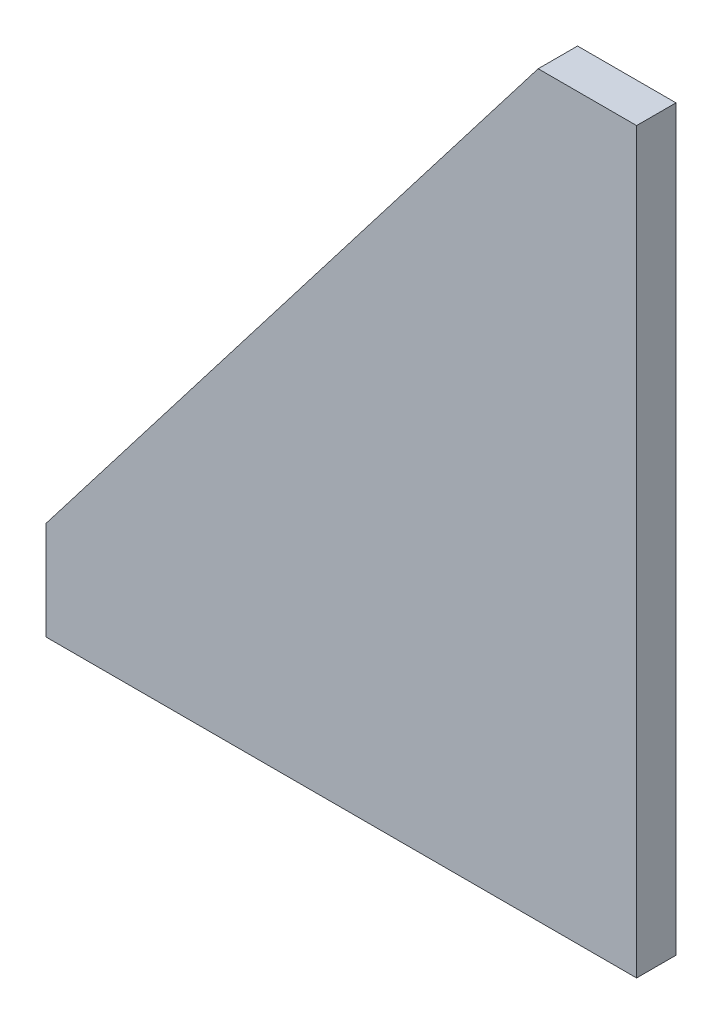
ISO-10303-21;
HEADER;
FILE_DESCRIPTION(('STEP AP214'),'2;1');
FILE_NAME('part.step','',(''),(''),'','','');
FILE_SCHEMA(('AUTOMOTIVE_DESIGN { 1 0 10303 214 1 1 1 1 }'));
ENDSEC;
DATA;
#1=APPLICATION_CONTEXT('core data for automotive mechanical design processes');
#2=APPLICATION_PROTOCOL_DEFINITION('international standard','automotive_design',2000,#1);
#3=PRODUCT_CONTEXT('',#1,'mechanical');
#4=PRODUCT('Part','Part','',(#3));
#5=PRODUCT_RELATED_PRODUCT_CATEGORY('part','',(#4));
#6=PRODUCT_DEFINITION_FORMATION('','',#4);
#7=PRODUCT_DEFINITION_CONTEXT('part definition',#1,'design');
#8=PRODUCT_DEFINITION('design','',#6,#7);
#9=PRODUCT_DEFINITION_SHAPE('','',#8);
#10=(LENGTH_UNIT() NAMED_UNIT(*) SI_UNIT(.MILLI.,.METRE.));
#11=(NAMED_UNIT(*) PLANE_ANGLE_UNIT() SI_UNIT($,.RADIAN.));
#12=(NAMED_UNIT(*) SI_UNIT($,.STERADIAN.) SOLID_ANGLE_UNIT());
#13=UNCERTAINTY_MEASURE_WITH_UNIT(LENGTH_MEASURE(1.E-05),#10,'distance_accuracy_value','');
#14=(GEOMETRIC_REPRESENTATION_CONTEXT(3) GLOBAL_UNCERTAINTY_ASSIGNED_CONTEXT((#13)) GLOBAL_UNIT_ASSIGNED_CONTEXT((#10,
#11,#12)) REPRESENTATION_CONTEXT('',''));
#15=CARTESIAN_POINT('',(0.,0.,0.));
#16=DIRECTION('',(0.,0.,1.));
#17=DIRECTION('',(1.,0.,0.));
#18=AXIS2_PLACEMENT_3D('',#15,#16,#17);
#19=CARTESIAN_POINT('',(0.,0.,-8.00000000000001));
#20=DIRECTION('',(0.,-1.,0.));
#21=DIRECTION('',(0.,0.,-1.00000000000001));
#22=AXIS2_PLACEMENT_3D('',#19,#20,#21);
#23=PLANE('',#22);
#24=DIRECTION('',(1.,0.,0.));
#25=VECTOR('',#24,1.);
#26=CARTESIAN_POINT('',(0.,0.,0.));
#27=LINE('',#26,#25);
#28=CARTESIAN_POINT('',(0.,0.,0.));
#29=VERTEX_POINT('',#28);
#30=CARTESIAN_POINT('',(119.999999999998,3.99680288865056E-12,0.));
#31=VERTEX_POINT('',#30);
#32=EDGE_CURVE('E113',#29,#31,#27,.T.);
#33=ORIENTED_EDGE('',*,*,#32,.F.);
#34=DIRECTION('',(0.,0.,1.00000000000001));
#35=VECTOR('',#34,1.);
#36=CARTESIAN_POINT('',(0.,0.,-8.00000000000001));
#37=LINE('',#36,#35);
#38=CARTESIAN_POINT('',(0.,0.,-8.00000000000001));
#39=VERTEX_POINT('',#38);
#40=EDGE_CURVE('E11',#39,#29,#37,.T.);
#41=ORIENTED_EDGE('',*,*,#40,.F.);
#42=DIRECTION('',(1.,0.,0.));
#43=VECTOR('',#42,1.);
#44=CARTESIAN_POINT('',(0.,0.,-8.00000000000001));
#45=LINE('',#44,#43);
#46=CARTESIAN_POINT('',(119.999999999998,3.99680288865056E-12,-8.00000000000001));
#47=VERTEX_POINT('',#46);
#48=EDGE_CURVE('E108',#39,#47,#45,.T.);
#49=ORIENTED_EDGE('',*,*,#48,.T.);
#50=DIRECTION('',(0.,0.,1.00000000000001));
#51=VECTOR('',#50,1.);
#52=CARTESIAN_POINT('',(119.999999999998,3.99680288865056E-12,-8.00000000000001));
#53=LINE('',#52,#51);
#54=EDGE_CURVE('E39',#47,#31,#53,.T.);
#55=ORIENTED_EDGE('',*,*,#54,.T.);
#56=EDGE_LOOP('',(#33,#41,#49,#55));
#57=FACE_BOUND('',#56,.T.);
#58=ADVANCED_FACE('F36',(#57),#23,.T.);
#59=CARTESIAN_POINT('',(0.,20.,-8.00000000000001));
#60=DIRECTION('',(-1.,0.,0.));
#61=DIRECTION('',(0.,-1.,0.));
#62=AXIS2_PLACEMENT_3D('',#59,#60,#61);
#63=PLANE('',#62);
#64=DIRECTION('',(0.,-1.,0.));
#65=VECTOR('',#64,1.);
#66=CARTESIAN_POINT('',(0.,20.,0.));
#67=LINE('',#66,#65);
#68=CARTESIAN_POINT('',(0.,20.,0.));
#69=VERTEX_POINT('',#68);
#70=EDGE_CURVE('E122',#69,#29,#67,.T.);
#71=ORIENTED_EDGE('',*,*,#70,.F.);
#72=DIRECTION('',(0.,0.,1.00000000000001));
#73=VECTOR('',#72,1.);
#74=CARTESIAN_POINT('',(0.,20.,-8.00000000000001));
#75=LINE('',#74,#73);
#76=CARTESIAN_POINT('',(0.,20.,-8.00000000000001));
#77=VERTEX_POINT('',#76);
#78=EDGE_CURVE('E45',#77,#69,#75,.T.);
#79=ORIENTED_EDGE('',*,*,#78,.F.);
#80=DIRECTION('',(0.,-1.,0.));
#81=VECTOR('',#80,1.);
#82=CARTESIAN_POINT('',(0.,20.,-8.00000000000001));
#83=LINE('',#82,#81);
#84=EDGE_CURVE('E103',#77,#39,#83,.T.);
#85=ORIENTED_EDGE('',*,*,#84,.T.);
#86=ORIENTED_EDGE('',*,*,#40,.T.);
#87=EDGE_LOOP('',(#71,#79,#85,#86));
#88=FACE_BOUND('',#87,.T.);
#89=ADVANCED_FACE('F128',(#88),#63,.T.);
#90=CARTESIAN_POINT('',(100.,150.,-8.00000000000001));
#91=DIRECTION('',(-0.792623989104602,0.609710760849694,0.));
#92=DIRECTION('',(-0.609710760849691,-0.792623989104598,0.));
#93=AXIS2_PLACEMENT_3D('',#90,#91,#92);
#94=PLANE('',#93);
#95=DIRECTION('',(-0.60971076084969,-0.792623989104598,0.));
#96=VECTOR('',#95,1.);
#97=CARTESIAN_POINT('',(100.,150.,0.));
#98=LINE('',#97,#96);
#99=CARTESIAN_POINT('',(100.,150.,0.));
#100=VERTEX_POINT('',#99);
#101=EDGE_CURVE('E92',#100,#69,#98,.T.);
#102=ORIENTED_EDGE('',*,*,#101,.F.);
#103=DIRECTION('',(0.,0.,1.00000000000001));
#104=VECTOR('',#103,1.);
#105=CARTESIAN_POINT('',(100.,150.,-8.00000000000001));
#106=LINE('',#105,#104);
#107=CARTESIAN_POINT('',(100.,150.,-8.00000000000001));
#108=VERTEX_POINT('',#107);
#109=EDGE_CURVE('E87',#108,#100,#106,.T.);
#110=ORIENTED_EDGE('',*,*,#109,.F.);
#111=DIRECTION('',(-0.60971076084969,-0.792623989104598,0.));
#112=VECTOR('',#111,1.);
#113=CARTESIAN_POINT('',(100.,150.,-8.00000000000001));
#114=LINE('',#113,#112);
#115=EDGE_CURVE('E90',#108,#77,#114,.T.);
#116=ORIENTED_EDGE('',*,*,#115,.T.);
#117=ORIENTED_EDGE('',*,*,#78,.T.);
#118=EDGE_LOOP('',(#102,#110,#116,#117));
#119=FACE_BOUND('',#118,.T.);
#120=ADVANCED_FACE('F89',(#119),#94,.T.);
#121=CARTESIAN_POINT('',(120.,150.000000000004,-8.00000000000001));
#122=DIRECTION('',(0.,1.,0.));
#123=DIRECTION('',(0.,0.,1.00000000000001));
#124=AXIS2_PLACEMENT_3D('',#121,#122,#123);
#125=PLANE('',#124);
#126=DIRECTION('',(-1.,0.,0.));
#127=VECTOR('',#126,1.);
#128=CARTESIAN_POINT('',(120.,150.000000000004,0.));
#129=LINE('',#128,#127);
#130=CARTESIAN_POINT('',(120.,150.000000000004,0.));
#131=VERTEX_POINT('',#130);
#132=EDGE_CURVE('E119',#131,#100,#129,.T.);
#133=ORIENTED_EDGE('',*,*,#132,.F.);
#134=DIRECTION('',(0.,0.,1.00000000000001));
#135=VECTOR('',#134,1.);
#136=CARTESIAN_POINT('',(120.,150.000000000004,-8.00000000000001));
#137=LINE('',#136,#135);
#138=CARTESIAN_POINT('',(120.,150.000000000004,-8.00000000000001));
#139=VERTEX_POINT('',#138);
#140=EDGE_CURVE('E97',#139,#131,#137,.T.);
#141=ORIENTED_EDGE('',*,*,#140,.F.);
#142=DIRECTION('',(-1.,0.,0.));
#143=VECTOR('',#142,1.);
#144=CARTESIAN_POINT('',(120.,150.000000000004,-8.00000000000001));
#145=LINE('',#144,#143);
#146=EDGE_CURVE('E102',#139,#108,#145,.T.);
#147=ORIENTED_EDGE('',*,*,#146,.T.);
#148=ORIENTED_EDGE('',*,*,#109,.T.);
#149=EDGE_LOOP('',(#133,#141,#147,#148));
#150=FACE_BOUND('',#149,.T.);
#151=ADVANCED_FACE('F105',(#150),#125,.T.);
#152=CARTESIAN_POINT('',(119.999999999998,3.99680288865056E-12,-8.00000000000001));
#153=DIRECTION('',(1.,0.,0.));
#154=DIRECTION('',(0.,0.,-1.00000000000001));
#155=AXIS2_PLACEMENT_3D('',#152,#153,#154);
#156=PLANE('',#155);
#157=DIRECTION('',(0.,1.,0.));
#158=VECTOR('',#157,1.);
#159=CARTESIAN_POINT('',(119.999999999998,3.99680288865056E-12,0.));
#160=LINE('',#159,#158);
#161=EDGE_CURVE('E116',#31,#131,#160,.T.);
#162=ORIENTED_EDGE('',*,*,#161,.F.);
#163=ORIENTED_EDGE('',*,*,#54,.F.);
#164=DIRECTION('',(0.,1.,0.));
#165=VECTOR('',#164,1.);
#166=CARTESIAN_POINT('',(119.999999999998,3.99680288865056E-12,-8.00000000000001));
#167=LINE('',#166,#165);
#168=EDGE_CURVE('E106',#47,#139,#167,.T.);
#169=ORIENTED_EDGE('',*,*,#168,.T.);
#170=ORIENTED_EDGE('',*,*,#140,.T.);
#171=EDGE_LOOP('',(#162,#163,#169,#170));
#172=FACE_BOUND('',#171,.T.);
#173=ADVANCED_FACE('F125',(#172),#156,.T.);
#174=CARTESIAN_POINT('',(0.,0.,-8.00000000000001));
#175=DIRECTION('',(0.,0.,1.00000000000001));
#176=DIRECTION('',(1.,0.,0.));
#177=AXIS2_PLACEMENT_3D('',#174,#175,#176);
#178=PLANE('',#177);
#179=ORIENTED_EDGE('',*,*,#48,.F.);
#180=ORIENTED_EDGE('',*,*,#84,.F.);
#181=ORIENTED_EDGE('',*,*,#115,.F.);
#182=ORIENTED_EDGE('',*,*,#146,.F.);
#183=ORIENTED_EDGE('',*,*,#168,.F.);
#184=EDGE_LOOP('',(#179,#180,#181,#182,#183));
#185=FACE_BOUND('',#184,.T.);
#186=ADVANCED_FACE('F101',(#185),#178,.F.);
#187=CARTESIAN_POINT('',(0.,0.,0.));
#188=DIRECTION('',(0.,0.,1.00000000000001));
#189=DIRECTION('',(1.,0.,0.));
#190=AXIS2_PLACEMENT_3D('',#187,#188,#189);
#191=PLANE('',#190);
#192=ORIENTED_EDGE('',*,*,#32,.T.);
#193=ORIENTED_EDGE('',*,*,#161,.T.);
#194=ORIENTED_EDGE('',*,*,#132,.T.);
#195=ORIENTED_EDGE('',*,*,#101,.T.);
#196=ORIENTED_EDGE('',*,*,#70,.T.);
#197=EDGE_LOOP('',(#192,#193,#194,#195,#196));
#198=FACE_BOUND('',#197,.T.);
#199=ADVANCED_FACE('F127',(#198),#191,.T.);
#200=CLOSED_SHELL('',(#58,#89,#120,#151,#173,#186,#199));
#201=MANIFOLD_SOLID_BREP('B2',#200);
#202=ADVANCED_BREP_SHAPE_REPRESENTATION('',(#18,#201),#14);
#203=SHAPE_DEFINITION_REPRESENTATION(#9,#202);
ENDSEC;
END-ISO-10303-21;
